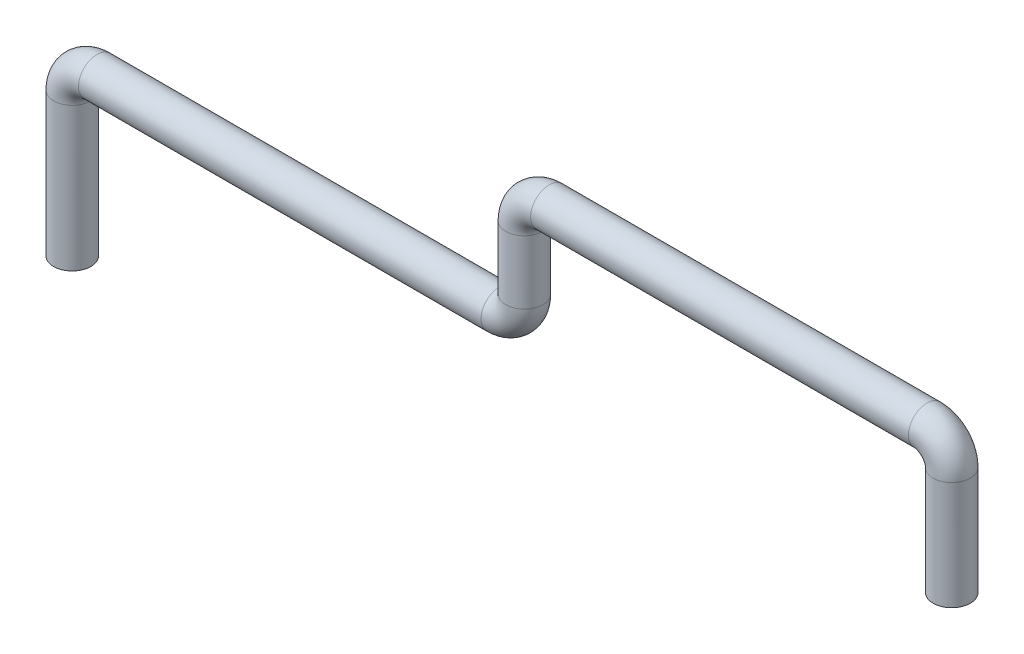
ISO-10303-21;
HEADER;
FILE_DESCRIPTION(('STEP AP214'),'2;1');
FILE_NAME('part.step','',(''),(''),'','','');
FILE_SCHEMA(('AUTOMOTIVE_DESIGN { 1 0 10303 214 1 1 1 1 }'));
ENDSEC;
DATA;
#1=APPLICATION_CONTEXT('core data for automotive mechanical design processes');
#2=APPLICATION_PROTOCOL_DEFINITION('international standard','automotive_design',2000,#1);
#3=PRODUCT_CONTEXT('',#1,'mechanical');
#4=PRODUCT('Part','Part','',(#3));
#5=PRODUCT_RELATED_PRODUCT_CATEGORY('part','',(#4));
#6=PRODUCT_DEFINITION_FORMATION('','',#4);
#7=PRODUCT_DEFINITION_CONTEXT('part definition',#1,'design');
#8=PRODUCT_DEFINITION('design','',#6,#7);
#9=PRODUCT_DEFINITION_SHAPE('','',#8);
#10=(LENGTH_UNIT() NAMED_UNIT(*) SI_UNIT(.MILLI.,.METRE.));
#11=(NAMED_UNIT(*) PLANE_ANGLE_UNIT() SI_UNIT($,.RADIAN.));
#12=(NAMED_UNIT(*) SI_UNIT($,.STERADIAN.) SOLID_ANGLE_UNIT());
#13=UNCERTAINTY_MEASURE_WITH_UNIT(LENGTH_MEASURE(1.E-05),#10,'distance_accuracy_value','');
#14=(GEOMETRIC_REPRESENTATION_CONTEXT(3) GLOBAL_UNCERTAINTY_ASSIGNED_CONTEXT((#13)) GLOBAL_UNIT_ASSIGNED_CONTEXT((#10,
#11,#12)) REPRESENTATION_CONTEXT('',''));
#15=CARTESIAN_POINT('',(0.,0.,0.));
#16=DIRECTION('',(0.,0.,1.));
#17=DIRECTION('',(1.,0.,0.));
#18=AXIS2_PLACEMENT_3D('',#15,#16,#17);
#19=CARTESIAN_POINT('',(0.,0.,0.));
#20=DIRECTION('',(0.,1.,0.));
#21=DIRECTION('',(0.,0.,1.));
#22=AXIS2_PLACEMENT_3D('',#19,#20,#21);
#23=PLANE('',#22);
#24=CARTESIAN_POINT('',(0.,0.,0.));
#25=DIRECTION('',(0.,1.,0.));
#26=DIRECTION('',(0.,0.,1.));
#27=AXIS2_PLACEMENT_3D('',#24,#25,#26);
#28=CIRCLE('',#27,0.6);
#29=CARTESIAN_POINT('',(0.,0.,0.6));
#30=VERTEX_POINT('',#29);
#31=EDGE_CURVE('E45',#30,#30,#28,.T.);
#32=ORIENTED_EDGE('',*,*,#31,.F.);
#33=EDGE_LOOP('',(#32));
#34=FACE_BOUND('',#33,.T.);
#35=ADVANCED_FACE('F33',(#34),#23,.F.);
#36=CARTESIAN_POINT('',(28.4,4.78373943278989,0.));
#37=DIRECTION('',(0.,-1.,0.));
#38=DIRECTION('',(0.,0.,1.));
#39=AXIS2_PLACEMENT_3D('',#36,#37,#38);
#40=PLANE('',#39);
#41=CARTESIAN_POINT('',(28.4,4.78373943278989,0.));
#42=DIRECTION('',(0.,-1.,0.));
#43=DIRECTION('',(0.,0.,1.));
#44=AXIS2_PLACEMENT_3D('',#41,#42,#43);
#45=CIRCLE('',#44,0.6);
#46=CARTESIAN_POINT('',(28.4,4.78373943278989,0.6));
#47=VERTEX_POINT('',#46);
#48=EDGE_CURVE('E11',#47,#47,#45,.T.);
#49=ORIENTED_EDGE('',*,*,#48,.T.);
#50=EDGE_LOOP('',(#49));
#51=FACE_BOUND('',#50,.T.);
#52=ADVANCED_FACE('F48',(#51),#40,.T.);
#53=CARTESIAN_POINT('',(0.,0.,0.));
#54=DIRECTION('',(0.,1.,0.));
#55=DIRECTION('',(-1.,0.,0.));
#56=AXIS2_PLACEMENT_3D('',#53,#54,#55);
#57=CYLINDRICAL_SURFACE('',#56,0.6);
#58=CARTESIAN_POINT('',(0.,4.63328634326747,0.));
#59=DIRECTION('',(0.,1.,0.));
#60=DIRECTION('',(0.,0.,1.));
#61=AXIS2_PLACEMENT_3D('',#58,#59,#60);
#62=CIRCLE('',#61,0.6);
#63=CARTESIAN_POINT('',(-0.6,4.63328634326747,0.));
#64=VERTEX_POINT('',#63);
#65=EDGE_CURVE('E77',#64,#64,#62,.T.);
#66=ORIENTED_EDGE('',*,*,#65,.F.);
#67=EDGE_LOOP('',(#66));
#68=FACE_BOUND('',#67,.T.);
#69=ORIENTED_EDGE('',*,*,#31,.T.);
#70=EDGE_LOOP('',(#69));
#71=FACE_BOUND('',#70,.T.);
#72=ADVANCED_FACE('F81',(#68,#71),#57,.T.);
#73=CARTESIAN_POINT('',(0.8,4.63328634326747,0.));
#74=DIRECTION('',(0.,0.,-1.));
#75=DIRECTION('',(-1.,0.,0.));
#76=AXIS2_PLACEMENT_3D('',#73,#74,#75);
#77=TOROIDAL_SURFACE('',#76,0.8,0.6);
#78=CARTESIAN_POINT('',(0.8,5.43328634326747,0.));
#79=DIRECTION('',(1.,0.,0.));
#80=DIRECTION('',(0.,0.,1.));
#81=AXIS2_PLACEMENT_3D('',#78,#79,#80);
#82=CIRCLE('',#81,0.6);
#83=CARTESIAN_POINT('',(0.8,6.03328634326747,0.));
#84=VERTEX_POINT('',#83);
#85=EDGE_CURVE('E74',#84,#84,#82,.T.);
#86=CARTESIAN_POINT('',(0.8,4.63328634326747,0.));
#87=DIRECTION('',(0.,0.,-1.));
#88=DIRECTION('',(-1.,0.,0.));
#89=AXIS2_PLACEMENT_3D('',#86,#87,#88);
#90=CIRCLE('',#89,1.4);
#91=EDGE_CURVE('',#64,#84,#90,.T.);
#92=ORIENTED_EDGE('',*,*,#65,.T.);
#93=ORIENTED_EDGE('',*,*,#85,.F.);
#94=ORIENTED_EDGE('',*,*,#91,.T.);
#95=ORIENTED_EDGE('',*,*,#91,.F.);
#96=EDGE_LOOP('',(#92,#94,#93,#95));
#97=FACE_BOUND('',#96,.T.);
#98=ADVANCED_FACE('F83',(#97),#77,.T.);
#99=CARTESIAN_POINT('',(0.800000000000004,5.43328634326747,0.));
#100=DIRECTION('',(1.,0.,0.));
#101=DIRECTION('',(0.,1.,0.));
#102=AXIS2_PLACEMENT_3D('',#99,#100,#101);
#103=CYLINDRICAL_SURFACE('',#102,0.6);
#104=CARTESIAN_POINT('',(13.8,5.43328634326747,0.));
#105=DIRECTION('',(1.,0.,0.));
#106=DIRECTION('',(0.,0.,1.));
#107=AXIS2_PLACEMENT_3D('',#104,#105,#106);
#108=CIRCLE('',#107,0.6);
#109=CARTESIAN_POINT('',(13.8,4.83328634326747,0.));
#110=VERTEX_POINT('',#109);
#111=EDGE_CURVE('E71',#110,#110,#108,.T.);
#112=ORIENTED_EDGE('',*,*,#111,.F.);
#113=EDGE_LOOP('',(#112));
#114=FACE_BOUND('',#113,.T.);
#115=ORIENTED_EDGE('',*,*,#85,.T.);
#116=EDGE_LOOP('',(#115));
#117=FACE_BOUND('',#116,.T.);
#118=ADVANCED_FACE('F90',(#114,#117),#103,.T.);
#119=CARTESIAN_POINT('',(13.8,6.23328634326747,0.));
#120=DIRECTION('',(0.,0.,1.));
#121=DIRECTION('',(1.,0.,0.));
#122=AXIS2_PLACEMENT_3D('',#119,#120,#121);
#123=TOROIDAL_SURFACE('',#122,0.8,0.6);
#124=CARTESIAN_POINT('',(14.6,6.23328634326747,0.));
#125=DIRECTION('',(0.,1.,0.));
#126=DIRECTION('',(0.,0.,1.));
#127=AXIS2_PLACEMENT_3D('',#124,#125,#126);
#128=CIRCLE('',#127,0.6);
#129=CARTESIAN_POINT('',(15.2,6.23328634326748,0.));
#130=VERTEX_POINT('',#129);
#131=EDGE_CURVE('E68',#130,#130,#128,.T.);
#132=CARTESIAN_POINT('',(13.8,6.23328634326747,0.));
#133=DIRECTION('',(0.,0.,1.));
#134=DIRECTION('',(1.,0.,0.));
#135=AXIS2_PLACEMENT_3D('',#132,#133,#134);
#136=CIRCLE('',#135,1.4);
#137=EDGE_CURVE('',#110,#130,#136,.T.);
#138=ORIENTED_EDGE('',*,*,#111,.T.);
#139=ORIENTED_EDGE('',*,*,#131,.F.);
#140=ORIENTED_EDGE('',*,*,#137,.T.);
#141=ORIENTED_EDGE('',*,*,#137,.F.);
#142=EDGE_LOOP('',(#138,#140,#139,#141));
#143=FACE_BOUND('',#142,.T.);
#144=ADVANCED_FACE('F97',(#143),#123,.T.);
#145=CARTESIAN_POINT('',(14.6,6.23328634326747,0.));
#146=DIRECTION('',(0.,1.,0.));
#147=DIRECTION('',(-1.,0.,0.));
#148=AXIS2_PLACEMENT_3D('',#145,#146,#147);
#149=CYLINDRICAL_SURFACE('',#148,0.6);
#150=CARTESIAN_POINT('',(14.6,8.28373943278988,0.));
#151=DIRECTION('',(0.,1.,0.));
#152=DIRECTION('',(0.,0.,1.));
#153=AXIS2_PLACEMENT_3D('',#150,#151,#152);
#154=CIRCLE('',#153,0.6);
#155=CARTESIAN_POINT('',(14.,8.28373943278988,0.));
#156=VERTEX_POINT('',#155);
#157=EDGE_CURVE('E65',#156,#156,#154,.T.);
#158=ORIENTED_EDGE('',*,*,#157,.F.);
#159=EDGE_LOOP('',(#158));
#160=FACE_BOUND('',#159,.T.);
#161=ORIENTED_EDGE('',*,*,#131,.T.);
#162=EDGE_LOOP('',(#161));
#163=FACE_BOUND('',#162,.T.);
#164=ADVANCED_FACE('F101',(#160,#163),#149,.T.);
#165=CARTESIAN_POINT('',(15.4,8.28373943278988,0.));
#166=DIRECTION('',(0.,0.,-1.));
#167=DIRECTION('',(-1.,0.,0.));
#168=AXIS2_PLACEMENT_3D('',#165,#166,#167);
#169=TOROIDAL_SURFACE('',#168,0.8,0.6);
#170=CARTESIAN_POINT('',(15.4,9.08373943278988,0.));
#171=DIRECTION('',(1.,0.,0.));
#172=DIRECTION('',(0.,0.,1.));
#173=AXIS2_PLACEMENT_3D('',#170,#171,#172);
#174=CIRCLE('',#173,0.6);
#175=CARTESIAN_POINT('',(15.4,9.68373943278988,0.));
#176=VERTEX_POINT('',#175);
#177=EDGE_CURVE('E60',#176,#176,#174,.T.);
#178=CARTESIAN_POINT('',(15.4,8.28373943278988,0.));
#179=DIRECTION('',(0.,0.,-1.));
#180=DIRECTION('',(-1.,0.,0.));
#181=AXIS2_PLACEMENT_3D('',#178,#179,#180);
#182=CIRCLE('',#181,1.4);
#183=EDGE_CURVE('',#156,#176,#182,.T.);
#184=ORIENTED_EDGE('',*,*,#157,.T.);
#185=ORIENTED_EDGE('',*,*,#177,.F.);
#186=ORIENTED_EDGE('',*,*,#183,.T.);
#187=ORIENTED_EDGE('',*,*,#183,.F.);
#188=EDGE_LOOP('',(#184,#186,#185,#187));
#189=FACE_BOUND('',#188,.T.);
#190=ADVANCED_FACE('F105',(#189),#169,.T.);
#191=CARTESIAN_POINT('',(15.4,9.08373943278988,0.));
#192=DIRECTION('',(1.,0.,0.));
#193=DIRECTION('',(0.,1.,0.));
#194=AXIS2_PLACEMENT_3D('',#191,#192,#193);
#195=CYLINDRICAL_SURFACE('',#194,0.6);
#196=CARTESIAN_POINT('',(27.6,9.08373943278988,0.));
#197=DIRECTION('',(1.,0.,0.));
#198=DIRECTION('',(0.,0.,1.));
#199=AXIS2_PLACEMENT_3D('',#196,#197,#198);
#200=CIRCLE('',#199,0.6);
#201=CARTESIAN_POINT('',(27.6,9.68373943278988,0.));
#202=VERTEX_POINT('',#201);
#203=EDGE_CURVE('E58',#202,#202,#200,.T.);
#204=ORIENTED_EDGE('',*,*,#203,.F.);
#205=EDGE_LOOP('',(#204));
#206=FACE_BOUND('',#205,.T.);
#207=ORIENTED_EDGE('',*,*,#177,.T.);
#208=EDGE_LOOP('',(#207));
#209=FACE_BOUND('',#208,.T.);
#210=ADVANCED_FACE('F109',(#206,#209),#195,.T.);
#211=CARTESIAN_POINT('',(27.6,8.28373943278988,0.));
#212=DIRECTION('',(0.,0.,-1.));
#213=DIRECTION('',(-1.,0.,0.));
#214=AXIS2_PLACEMENT_3D('',#211,#212,#213);
#215=TOROIDAL_SURFACE('',#214,0.8,0.6);
#216=CARTESIAN_POINT('',(28.4,8.28373943278988,0.));
#217=DIRECTION('',(0.,-1.,0.));
#218=DIRECTION('',(0.,0.,1.));
#219=AXIS2_PLACEMENT_3D('',#216,#217,#218);
#220=CIRCLE('',#219,0.6);
#221=CARTESIAN_POINT('',(29.,8.28373943278988,0.));
#222=VERTEX_POINT('',#221);
#223=EDGE_CURVE('E40',#222,#222,#220,.T.);
#224=CARTESIAN_POINT('',(27.6,8.28373943278988,0.));
#225=DIRECTION('',(0.,0.,-1.));
#226=DIRECTION('',(-1.,0.,0.));
#227=AXIS2_PLACEMENT_3D('',#224,#225,#226);
#228=CIRCLE('',#227,1.4);
#229=EDGE_CURVE('',#202,#222,#228,.T.);
#230=ORIENTED_EDGE('',*,*,#203,.T.);
#231=ORIENTED_EDGE('',*,*,#223,.F.);
#232=ORIENTED_EDGE('',*,*,#229,.T.);
#233=ORIENTED_EDGE('',*,*,#229,.F.);
#234=EDGE_LOOP('',(#230,#232,#231,#233));
#235=FACE_BOUND('',#234,.T.);
#236=ADVANCED_FACE('F53',(#235),#215,.T.);
#237=CARTESIAN_POINT('',(28.4,8.28373943278988,0.));
#238=DIRECTION('',(0.,-1.,0.));
#239=DIRECTION('',(0.,0.,-1.));
#240=AXIS2_PLACEMENT_3D('',#237,#238,#239);
#241=CYLINDRICAL_SURFACE('',#240,0.6);
#242=ORIENTED_EDGE('',*,*,#48,.F.);
#243=EDGE_LOOP('',(#242));
#244=FACE_BOUND('',#243,.T.);
#245=ORIENTED_EDGE('',*,*,#223,.T.);
#246=EDGE_LOOP('',(#245));
#247=FACE_BOUND('',#246,.T.);
#248=ADVANCED_FACE('F50',(#244,#247),#241,.T.);
#249=CLOSED_SHELL('',(#35,#52,#72,#98,#118,#144,#164,#190,#210,#236,#248));
#250=MANIFOLD_SOLID_BREP('B2',#249);
#251=ADVANCED_BREP_SHAPE_REPRESENTATION('',(#18,#250),#14);
#252=SHAPE_DEFINITION_REPRESENTATION(#9,#251);
ENDSEC;
END-ISO-10303-21;
